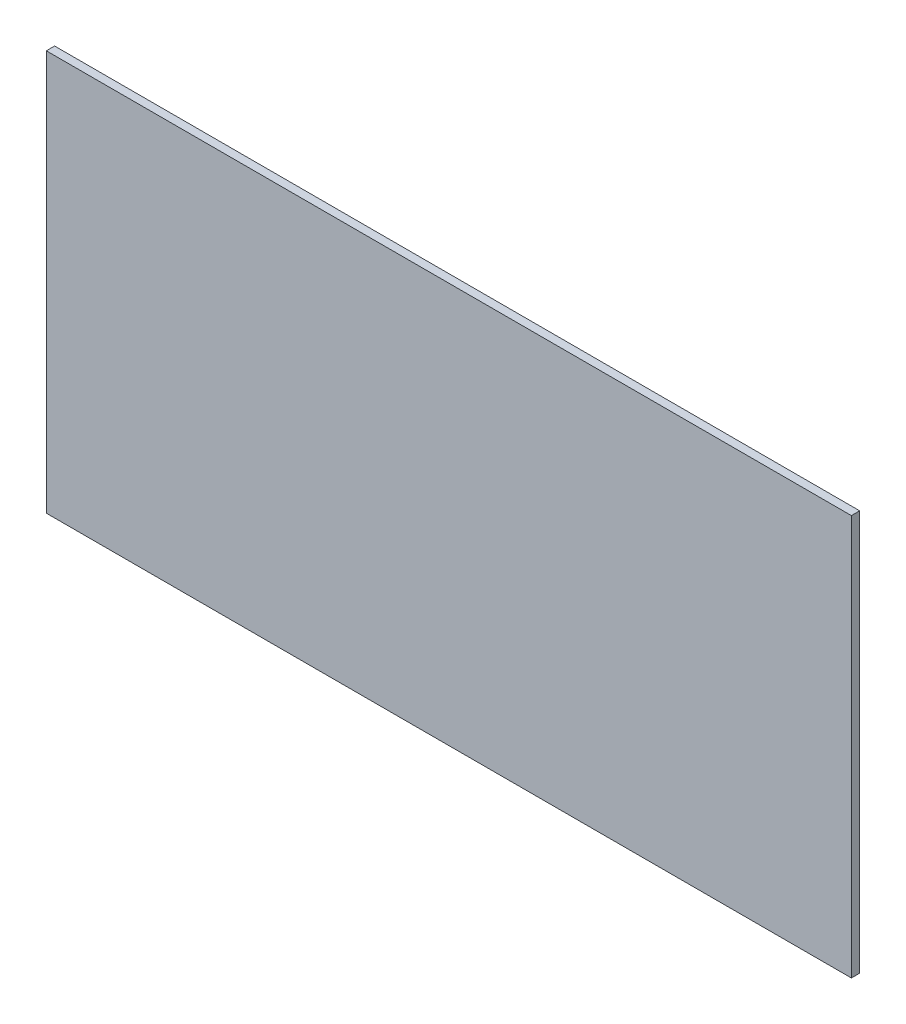
ISO-10303-21;
HEADER;
FILE_DESCRIPTION(('STEP AP214'),'2;1');
FILE_NAME('part.step','',(''),(''),'','','');
FILE_SCHEMA(('AUTOMOTIVE_DESIGN { 1 0 10303 214 1 1 1 1 }'));
ENDSEC;
DATA;
#1=APPLICATION_CONTEXT('core data for automotive mechanical design processes');
#2=APPLICATION_PROTOCOL_DEFINITION('international standard','automotive_design',2000,#1);
#3=PRODUCT_CONTEXT('',#1,'mechanical');
#4=PRODUCT('Part','Part','',(#3));
#5=PRODUCT_RELATED_PRODUCT_CATEGORY('part','',(#4));
#6=PRODUCT_DEFINITION_FORMATION('','',#4);
#7=PRODUCT_DEFINITION_CONTEXT('part definition',#1,'design');
#8=PRODUCT_DEFINITION('design','',#6,#7);
#9=PRODUCT_DEFINITION_SHAPE('','',#8);
#10=(LENGTH_UNIT() NAMED_UNIT(*) SI_UNIT(.MILLI.,.METRE.));
#11=(NAMED_UNIT(*) PLANE_ANGLE_UNIT() SI_UNIT($,.RADIAN.));
#12=(NAMED_UNIT(*) SI_UNIT($,.STERADIAN.) SOLID_ANGLE_UNIT());
#13=UNCERTAINTY_MEASURE_WITH_UNIT(LENGTH_MEASURE(1.E-05),#10,'distance_accuracy_value','');
#14=(GEOMETRIC_REPRESENTATION_CONTEXT(3) GLOBAL_UNCERTAINTY_ASSIGNED_CONTEXT((#13)) GLOBAL_UNIT_ASSIGNED_CONTEXT((#10,
#11,#12)) REPRESENTATION_CONTEXT('',''));
#15=CARTESIAN_POINT('',(0.,0.,0.));
#16=DIRECTION('',(0.,0.,1.));
#17=DIRECTION('',(1.,0.,0.));
#18=AXIS2_PLACEMENT_3D('',#15,#16,#17);
#19=CARTESIAN_POINT('',(-194.,-96.5,4.));
#20=DIRECTION('',(1.,0.,0.));
#21=DIRECTION('',(0.,0.,-1.));
#22=AXIS2_PLACEMENT_3D('',#19,#20,#21);
#23=PLANE('',#22);
#24=DIRECTION('',(0.,-1.,0.));
#25=VECTOR('',#24,1.);
#26=CARTESIAN_POINT('',(-194.,-96.5,0.));
#27=LINE('',#26,#25);
#28=CARTESIAN_POINT('',(-194.,96.5,0.));
#29=VERTEX_POINT('',#28);
#30=CARTESIAN_POINT('',(-194.,-96.5,0.));
#31=VERTEX_POINT('',#30);
#32=EDGE_CURVE('E96',#29,#31,#27,.T.);
#33=ORIENTED_EDGE('',*,*,#32,.T.);
#34=DIRECTION('',(0.,0.,-1.));
#35=VECTOR('',#34,1.);
#36=CARTESIAN_POINT('',(-194.,-96.5,4.));
#37=LINE('',#36,#35);
#38=CARTESIAN_POINT('',(-194.,-96.5,4.));
#39=VERTEX_POINT('',#38);
#40=EDGE_CURVE('E11',#39,#31,#37,.T.);
#41=ORIENTED_EDGE('',*,*,#40,.F.);
#42=DIRECTION('',(0.,-1.,0.));
#43=VECTOR('',#42,1.);
#44=CARTESIAN_POINT('',(-194.,-96.5,4.));
#45=LINE('',#44,#43);
#46=CARTESIAN_POINT('',(-194.,96.5,4.));
#47=VERTEX_POINT('',#46);
#48=EDGE_CURVE('E84',#47,#39,#45,.T.);
#49=ORIENTED_EDGE('',*,*,#48,.F.);
#50=DIRECTION('',(0.,0.,-1.));
#51=VECTOR('',#50,1.);
#52=CARTESIAN_POINT('',(-194.,96.5,4.));
#53=LINE('',#52,#51);
#54=EDGE_CURVE('E92',#47,#29,#53,.T.);
#55=ORIENTED_EDGE('',*,*,#54,.T.);
#56=EDGE_LOOP('',(#33,#41,#49,#55));
#57=FACE_BOUND('',#56,.T.);
#58=ADVANCED_FACE('F33',(#57),#23,.F.);
#59=CARTESIAN_POINT('',(194.,-96.4999999999999,4.));
#60=DIRECTION('',(0.,1.,0.));
#61=DIRECTION('',(-1.,0.,0.));
#62=AXIS2_PLACEMENT_3D('',#59,#60,#61);
#63=PLANE('',#62);
#64=DIRECTION('',(1.,0.,0.));
#65=VECTOR('',#64,1.);
#66=CARTESIAN_POINT('',(194.,-96.4999999999999,0.));
#67=LINE('',#66,#65);
#68=CARTESIAN_POINT('',(194.,-96.4999999999999,0.));
#69=VERTEX_POINT('',#68);
#70=EDGE_CURVE('E88',#31,#69,#67,.T.);
#71=ORIENTED_EDGE('',*,*,#70,.T.);
#72=DIRECTION('',(0.,0.,-1.));
#73=VECTOR('',#72,1.);
#74=CARTESIAN_POINT('',(194.,-96.4999999999999,4.));
#75=LINE('',#74,#73);
#76=CARTESIAN_POINT('',(194.,-96.4999999999999,4.));
#77=VERTEX_POINT('',#76);
#78=EDGE_CURVE('E41',#77,#69,#75,.T.);
#79=ORIENTED_EDGE('',*,*,#78,.F.);
#80=DIRECTION('',(1.,0.,0.));
#81=VECTOR('',#80,1.);
#82=CARTESIAN_POINT('',(194.,-96.4999999999999,4.));
#83=LINE('',#82,#81);
#84=EDGE_CURVE('E79',#39,#77,#83,.T.);
#85=ORIENTED_EDGE('',*,*,#84,.F.);
#86=ORIENTED_EDGE('',*,*,#40,.T.);
#87=EDGE_LOOP('',(#71,#79,#85,#86));
#88=FACE_BOUND('',#87,.T.);
#89=ADVANCED_FACE('F87',(#88),#63,.F.);
#90=CARTESIAN_POINT('',(194.,-96.4999999999999,4.));
#91=DIRECTION('',(-1.,0.,0.));
#92=DIRECTION('',(0.,0.,1.));
#93=AXIS2_PLACEMENT_3D('',#90,#91,#92);
#94=PLANE('',#93);
#95=DIRECTION('',(0.,1.,0.));
#96=VECTOR('',#95,1.);
#97=CARTESIAN_POINT('',(194.,-96.4999999999999,0.));
#98=LINE('',#97,#96);
#99=CARTESIAN_POINT('',(194.,96.5000000000001,0.));
#100=VERTEX_POINT('',#99);
#101=EDGE_CURVE('E66',#69,#100,#98,.T.);
#102=ORIENTED_EDGE('',*,*,#101,.T.);
#103=DIRECTION('',(0.,0.,-1.));
#104=VECTOR('',#103,1.);
#105=CARTESIAN_POINT('',(194.,96.5000000000001,4.));
#106=LINE('',#105,#104);
#107=CARTESIAN_POINT('',(194.,96.5000000000001,4.));
#108=VERTEX_POINT('',#107);
#109=EDGE_CURVE('E89',#108,#100,#106,.T.);
#110=ORIENTED_EDGE('',*,*,#109,.F.);
#111=DIRECTION('',(0.,1.,0.));
#112=VECTOR('',#111,1.);
#113=CARTESIAN_POINT('',(194.,-96.4999999999999,4.));
#114=LINE('',#113,#112);
#115=EDGE_CURVE('E82',#77,#108,#114,.T.);
#116=ORIENTED_EDGE('',*,*,#115,.F.);
#117=ORIENTED_EDGE('',*,*,#78,.T.);
#118=EDGE_LOOP('',(#102,#110,#116,#117));
#119=FACE_BOUND('',#118,.T.);
#120=ADVANCED_FACE('F90',(#119),#94,.F.);
#121=CARTESIAN_POINT('',(194.,96.5000000000001,4.));
#122=DIRECTION('',(0.,-1.,0.));
#123=DIRECTION('',(1.,0.,0.));
#124=AXIS2_PLACEMENT_3D('',#121,#122,#123);
#125=PLANE('',#124);
#126=DIRECTION('',(-1.,0.,0.));
#127=VECTOR('',#126,1.);
#128=CARTESIAN_POINT('',(194.,96.5000000000001,0.));
#129=LINE('',#128,#127);
#130=EDGE_CURVE('E72',#100,#29,#129,.T.);
#131=ORIENTED_EDGE('',*,*,#130,.T.);
#132=ORIENTED_EDGE('',*,*,#54,.F.);
#133=DIRECTION('',(-1.,0.,0.));
#134=VECTOR('',#133,1.);
#135=CARTESIAN_POINT('',(194.,96.5000000000001,4.));
#136=LINE('',#135,#134);
#137=EDGE_CURVE('E49',#108,#47,#136,.T.);
#138=ORIENTED_EDGE('',*,*,#137,.F.);
#139=ORIENTED_EDGE('',*,*,#109,.T.);
#140=EDGE_LOOP('',(#131,#132,#138,#139));
#141=FACE_BOUND('',#140,.T.);
#142=ADVANCED_FACE('F103',(#141),#125,.F.);
#143=CARTESIAN_POINT('',(0.,0.,4.));
#144=DIRECTION('',(0.,0.,1.));
#145=DIRECTION('',(1.,0.,0.));
#146=AXIS2_PLACEMENT_3D('',#143,#144,#145);
#147=PLANE('',#146);
#148=ORIENTED_EDGE('',*,*,#48,.T.);
#149=ORIENTED_EDGE('',*,*,#84,.T.);
#150=ORIENTED_EDGE('',*,*,#115,.T.);
#151=ORIENTED_EDGE('',*,*,#137,.T.);
#152=EDGE_LOOP('',(#148,#149,#150,#151));
#153=FACE_BOUND('',#152,.T.);
#154=ADVANCED_FACE('F80',(#153),#147,.T.);
#155=CARTESIAN_POINT('',(0.,0.,0.));
#156=DIRECTION('',(0.,0.,1.));
#157=DIRECTION('',(1.,0.,0.));
#158=AXIS2_PLACEMENT_3D('',#155,#156,#157);
#159=PLANE('',#158);
#160=ORIENTED_EDGE('',*,*,#32,.F.);
#161=ORIENTED_EDGE('',*,*,#130,.F.);
#162=ORIENTED_EDGE('',*,*,#101,.F.);
#163=ORIENTED_EDGE('',*,*,#70,.F.);
#164=EDGE_LOOP('',(#160,#161,#162,#163));
#165=FACE_BOUND('',#164,.T.);
#166=ADVANCED_FACE('F106',(#165),#159,.F.);
#167=CLOSED_SHELL('',(#58,#89,#120,#142,#154,#166));
#168=MANIFOLD_SOLID_BREP('B2',#167);
#169=ADVANCED_BREP_SHAPE_REPRESENTATION('',(#18,#168),#14);
#170=SHAPE_DEFINITION_REPRESENTATION(#9,#169);
ENDSEC;
END-ISO-10303-21;
